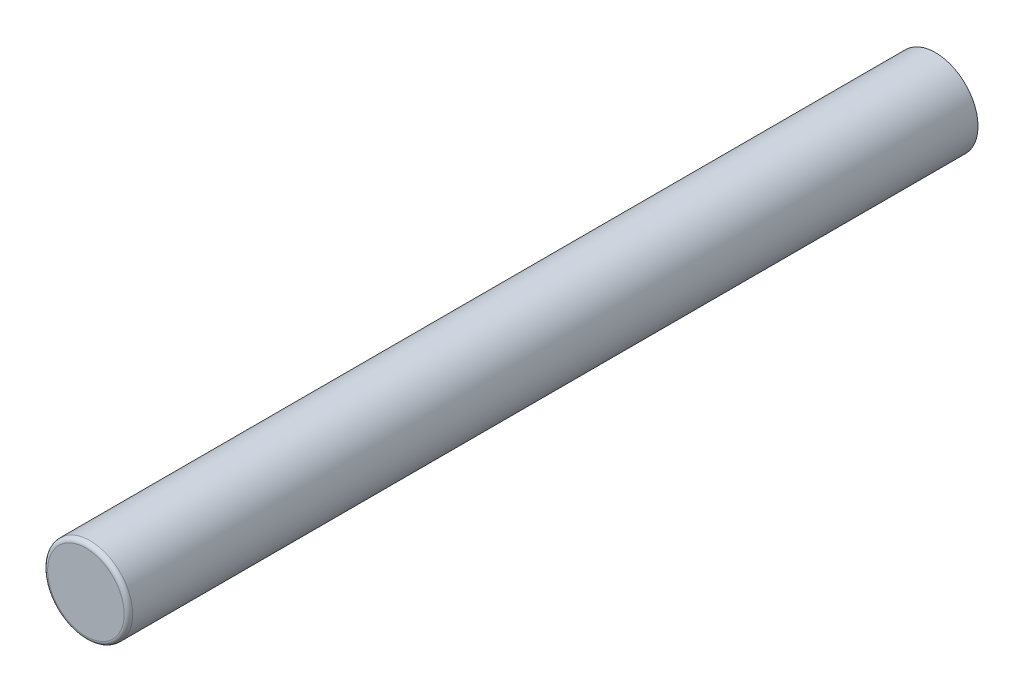
ISO-10303-21;
HEADER;
FILE_DESCRIPTION(('STEP AP214'),'2;1');
FILE_NAME('part.step','',(''),(''),'','','');
FILE_SCHEMA(('AUTOMOTIVE_DESIGN { 1 0 10303 214 1 1 1 1 }'));
ENDSEC;
DATA;
#1=APPLICATION_CONTEXT('core data for automotive mechanical design processes');
#2=APPLICATION_PROTOCOL_DEFINITION('international standard','automotive_design',2000,#1);
#3=PRODUCT_CONTEXT('',#1,'mechanical');
#4=PRODUCT('Part','Part','',(#3));
#5=PRODUCT_RELATED_PRODUCT_CATEGORY('part','',(#4));
#6=PRODUCT_DEFINITION_FORMATION('','',#4);
#7=PRODUCT_DEFINITION_CONTEXT('part definition',#1,'design');
#8=PRODUCT_DEFINITION('design','',#6,#7);
#9=PRODUCT_DEFINITION_SHAPE('','',#8);
#10=(LENGTH_UNIT() NAMED_UNIT(*) SI_UNIT(.MILLI.,.METRE.));
#11=(NAMED_UNIT(*) PLANE_ANGLE_UNIT() SI_UNIT($,.RADIAN.));
#12=(NAMED_UNIT(*) SI_UNIT($,.STERADIAN.) SOLID_ANGLE_UNIT());
#13=UNCERTAINTY_MEASURE_WITH_UNIT(LENGTH_MEASURE(1.E-05),#10,'distance_accuracy_value','');
#14=(GEOMETRIC_REPRESENTATION_CONTEXT(3) GLOBAL_UNCERTAINTY_ASSIGNED_CONTEXT((#13)) GLOBAL_UNIT_ASSIGNED_CONTEXT((#10,
#11,#12)) REPRESENTATION_CONTEXT('',''));
#15=CARTESIAN_POINT('',(0.,0.,0.));
#16=DIRECTION('',(0.,0.,1.));
#17=DIRECTION('',(1.,0.,0.));
#18=AXIS2_PLACEMENT_3D('',#15,#16,#17);
#19=CARTESIAN_POINT('',(0.,0.,10.));
#20=DIRECTION('',(0.,0.,-1.));
#21=DIRECTION('',(-1.,0.,0.));
#22=AXIS2_PLACEMENT_3D('',#19,#20,#21);
#23=CYLINDRICAL_SURFACE('',#22,1.);
#24=CARTESIAN_POINT('',(0.,0.,9.9));
#25=DIRECTION('',(0.,0.,1.));
#26=DIRECTION('',(1.,0.,0.));
#27=AXIS2_PLACEMENT_3D('',#24,#25,#26);
#28=CIRCLE('',#27,1.);
#29=CARTESIAN_POINT('',(1.,0.,9.9));
#30=VERTEX_POINT('',#29);
#31=EDGE_CURVE('E10',#30,#30,#28,.F.);
#32=ORIENTED_EDGE('',*,*,#31,.T.);
#33=EDGE_LOOP('',(#32));
#34=FACE_BOUND('',#33,.T.);
#35=CARTESIAN_POINT('',(0.,0.,-10.));
#36=DIRECTION('',(0.,0.,1.));
#37=DIRECTION('',(1.,0.,0.));
#38=AXIS2_PLACEMENT_3D('',#35,#36,#37);
#39=CIRCLE('',#38,1.);
#40=CARTESIAN_POINT('',(1.,0.,-10.));
#41=VERTEX_POINT('',#40);
#42=EDGE_CURVE('E46',#41,#41,#39,.T.);
#43=ORIENTED_EDGE('',*,*,#42,.T.);
#44=EDGE_LOOP('',(#43));
#45=FACE_BOUND('',#44,.T.);
#46=ADVANCED_FACE('F35',(#34,#45),#23,.T.);
#47=CARTESIAN_POINT('',(0.,0.,10.));
#48=DIRECTION('',(0.,0.,1.));
#49=DIRECTION('',(1.,0.,0.));
#50=AXIS2_PLACEMENT_3D('',#47,#48,#49);
#51=PLANE('',#50);
#52=CARTESIAN_POINT('',(0.,0.,10.));
#53=DIRECTION('',(0.,0.,1.));
#54=DIRECTION('',(1.,0.,0.));
#55=AXIS2_PLACEMENT_3D('',#52,#53,#54);
#56=CIRCLE('',#55,0.900000000000001);
#57=CARTESIAN_POINT('',(0.900000000000001,0.,10.));
#58=VERTEX_POINT('',#57);
#59=EDGE_CURVE('E42',#58,#58,#56,.T.);
#60=ORIENTED_EDGE('',*,*,#59,.T.);
#61=EDGE_LOOP('',(#60));
#62=FACE_BOUND('',#61,.T.);
#63=ADVANCED_FACE('F56',(#62),#51,.T.);
#64=CARTESIAN_POINT('',(0.,0.,-10.));
#65=DIRECTION('',(0.,0.,1.));
#66=DIRECTION('',(1.,0.,0.));
#67=AXIS2_PLACEMENT_3D('',#64,#65,#66);
#68=PLANE('',#67);
#69=ORIENTED_EDGE('',*,*,#42,.F.);
#70=EDGE_LOOP('',(#69));
#71=FACE_BOUND('',#70,.T.);
#72=ADVANCED_FACE('F54',(#71),#68,.F.);
#73=CARTESIAN_POINT('',(0.,0.,9.9));
#74=DIRECTION('',(0.,0.,1.));
#75=DIRECTION('',(1.,0.,0.));
#76=AXIS2_PLACEMENT_3D('',#73,#74,#75);
#77=TOROIDAL_SURFACE('',#76,0.900000000000001,0.1);
#78=ORIENTED_EDGE('',*,*,#31,.F.);
#79=EDGE_LOOP('',(#78));
#80=FACE_BOUND('',#79,.T.);
#81=ORIENTED_EDGE('',*,*,#59,.F.);
#82=EDGE_LOOP('',(#81));
#83=FACE_BOUND('',#82,.T.);
#84=ADVANCED_FACE('F37',(#80,#83),#77,.T.);
#85=CLOSED_SHELL('',(#46,#63,#72,#84));
#86=MANIFOLD_SOLID_BREP('B2',#85);
#87=ADVANCED_BREP_SHAPE_REPRESENTATION('',(#18,#86),#14);
#88=SHAPE_DEFINITION_REPRESENTATION(#9,#87);
ENDSEC;
END-ISO-10303-21;
